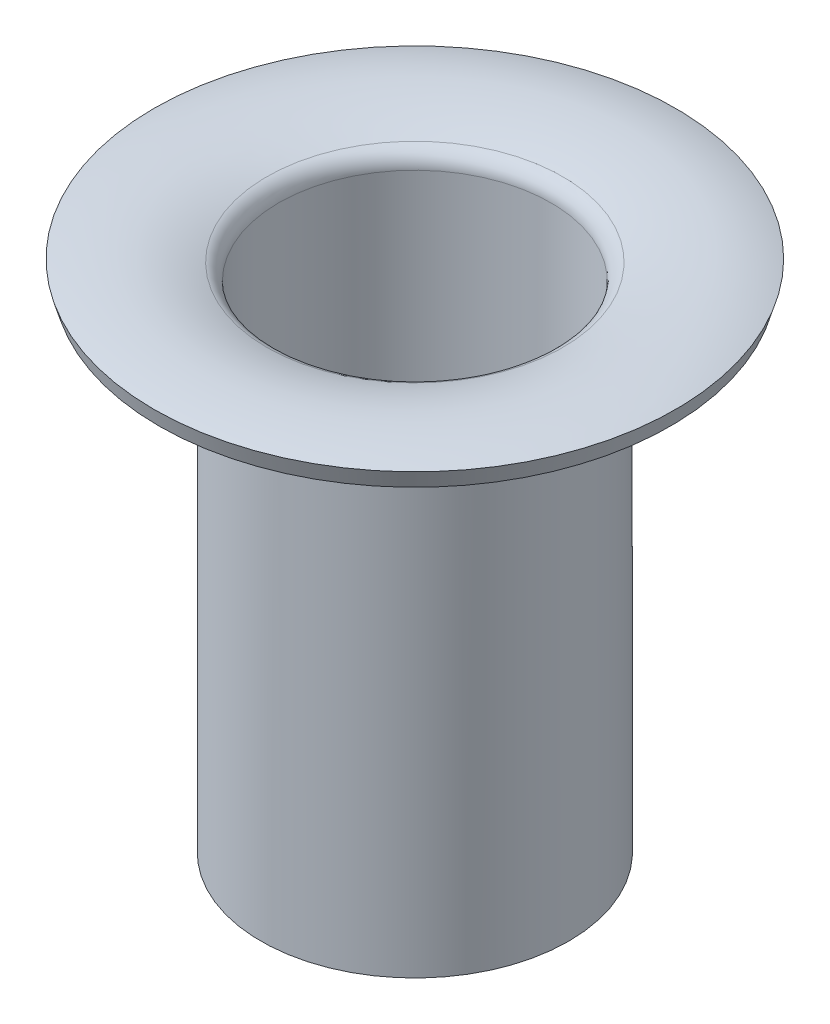
ISO-10303-21;
HEADER;
FILE_DESCRIPTION(('STEP AP214'),'2;1');
FILE_NAME('part.step','',(''),(''),'','','');
FILE_SCHEMA(('AUTOMOTIVE_DESIGN { 1 0 10303 214 1 1 1 1 }'));
ENDSEC;
DATA;
#1=APPLICATION_CONTEXT('core data for automotive mechanical design processes');
#2=APPLICATION_PROTOCOL_DEFINITION('international standard','automotive_design',2000,#1);
#3=PRODUCT_CONTEXT('',#1,'mechanical');
#4=PRODUCT('Part','Part','',(#3));
#5=PRODUCT_RELATED_PRODUCT_CATEGORY('part','',(#4));
#6=PRODUCT_DEFINITION_FORMATION('','',#4);
#7=PRODUCT_DEFINITION_CONTEXT('part definition',#1,'design');
#8=PRODUCT_DEFINITION('design','',#6,#7);
#9=PRODUCT_DEFINITION_SHAPE('','',#8);
#10=(LENGTH_UNIT() NAMED_UNIT(*) SI_UNIT(.MILLI.,.METRE.));
#11=(NAMED_UNIT(*) PLANE_ANGLE_UNIT() SI_UNIT($,.RADIAN.));
#12=(NAMED_UNIT(*) SI_UNIT($,.STERADIAN.) SOLID_ANGLE_UNIT());
#13=UNCERTAINTY_MEASURE_WITH_UNIT(LENGTH_MEASURE(1.E-05),#10,'distance_accuracy_value','');
#14=(GEOMETRIC_REPRESENTATION_CONTEXT(3) GLOBAL_UNCERTAINTY_ASSIGNED_CONTEXT((#13)) GLOBAL_UNIT_ASSIGNED_CONTEXT((#10,
#11,#12)) REPRESENTATION_CONTEXT('',''));
#15=CARTESIAN_POINT('',(0.,0.,0.));
#16=DIRECTION('',(0.,0.,1.));
#17=DIRECTION('',(1.,0.,0.));
#18=AXIS2_PLACEMENT_3D('',#15,#16,#17);
#19=CARTESIAN_POINT('',(0.,-1.75,0.));
#20=DIRECTION('',(0.,-1.,0.));
#21=DIRECTION('',(0.,0.,-1.));
#22=AXIS2_PLACEMENT_3D('',#19,#20,#21);
#23=TOROIDAL_SURFACE('',#22,2.,1.58);
#24=CARTESIAN_POINT('',(0.,-0.235862540950143,0.));
#25=DIRECTION('',(0.,-1.,0.));
#26=DIRECTION('',(1.,0.,0.));
#27=AXIS2_PLACEMENT_3D('',#24,#25,#26);
#28=CIRCLE('',#27,2.45142857142857);
#29=CARTESIAN_POINT('',(-2.45142857142857,-0.235862540950143,0.));
#30=VERTEX_POINT('',#29);
#31=CARTESIAN_POINT('',(0.,-0.235862540950143,2.45142857142857));
#32=VERTEX_POINT('',#31);
#33=EDGE_CURVE('E89',#30,#32,#28,.T.);
#34=ORIENTED_EDGE('',*,*,#33,.T.);
#35=CARTESIAN_POINT('',(0.,-1.75,2.));
#36=DIRECTION('',(-1.,0.,0.));
#37=DIRECTION('',(0.,0.,1.));
#38=AXIS2_PLACEMENT_3D('',#35,#36,#37);
#39=CIRCLE('',#38,1.58);
#40=CARTESIAN_POINT('',(0.,-0.25977350714732,1.475));
#41=VERTEX_POINT('',#40);
#42=EDGE_CURVE('E13',#32,#41,#39,.T.);
#43=ORIENTED_EDGE('',*,*,#42,.T.);
#44=CARTESIAN_POINT('',(0.,-0.25977350714732,0.));
#45=DIRECTION('',(0.,-1.,0.));
#46=DIRECTION('',(1.,0.,0.));
#47=AXIS2_PLACEMENT_3D('',#44,#45,#46);
#48=CIRCLE('',#47,1.475);
#49=CARTESIAN_POINT('',(-1.475,-0.25977350714732,0.));
#50=VERTEX_POINT('',#49);
#51=EDGE_CURVE('E86',#50,#41,#48,.T.);
#52=ORIENTED_EDGE('',*,*,#51,.F.);
#53=CARTESIAN_POINT('',(0.,-0.25977350714732,0.));
#54=DIRECTION('',(0.,-1.,0.));
#55=DIRECTION('',(1.,0.,0.));
#56=AXIS2_PLACEMENT_3D('',#53,#54,#55);
#57=CIRCLE('',#56,1.475);
#58=EDGE_CURVE('E28',#41,#50,#57,.T.);
#59=ORIENTED_EDGE('',*,*,#58,.F.);
#60=ORIENTED_EDGE('',*,*,#42,.F.);
#61=CARTESIAN_POINT('',(0.,-0.235862540950143,0.));
#62=DIRECTION('',(0.,-1.,0.));
#63=DIRECTION('',(1.,0.,0.));
#64=AXIS2_PLACEMENT_3D('',#61,#62,#63);
#65=CIRCLE('',#64,2.45142857142857);
#66=EDGE_CURVE('E34',#32,#30,#65,.T.);
#67=ORIENTED_EDGE('',*,*,#66,.T.);
#68=EDGE_LOOP('',(#34,#43,#52,#59,#60,#67));
#69=FACE_BOUND('',#68,.T.);
#70=ADVANCED_FACE('F24',(#69),#23,.F.);
#71=CARTESIAN_POINT('',(0.,-0.15440577891265,0.));
#72=DIRECTION('',(0.,1.,0.));
#73=DIRECTION('',(1.,0.,0.));
#74=AXIS2_PLACEMENT_3D('',#71,#72,#73);
#75=CONICAL_SURFACE('',#74,2.47571428571429,0.289751701436047);
#76=ORIENTED_EDGE('',*,*,#33,.F.);
#77=DIRECTION('',(-0.285714285714285,0.95831484749991,0.));
#78=VECTOR('',#77,1.);
#79=CARTESIAN_POINT('',(-2.47571428571429,-0.15440577891265,0.));
#80=LINE('',#79,#78);
#81=CARTESIAN_POINT('',(-2.5,-0.0729490168751576,0.));
#82=VERTEX_POINT('',#81);
#83=EDGE_CURVE('E121',#30,#82,#80,.T.);
#84=ORIENTED_EDGE('',*,*,#83,.T.);
#85=CARTESIAN_POINT('',(0.,-0.0729490168751579,0.));
#86=DIRECTION('',(0.,-1.,0.));
#87=DIRECTION('',(1.,0.,0.));
#88=AXIS2_PLACEMENT_3D('',#85,#86,#87);
#89=CIRCLE('',#88,2.5);
#90=CARTESIAN_POINT('',(0.,-0.0729490168751579,2.5));
#91=VERTEX_POINT('',#90);
#92=EDGE_CURVE('E107',#82,#91,#89,.T.);
#93=ORIENTED_EDGE('',*,*,#92,.T.);
#94=CARTESIAN_POINT('',(0.,-0.0729490168751579,0.));
#95=DIRECTION('',(0.,-1.,0.));
#96=DIRECTION('',(1.,0.,0.));
#97=AXIS2_PLACEMENT_3D('',#94,#95,#96);
#98=CIRCLE('',#97,2.5);
#99=EDGE_CURVE('E111',#91,#82,#98,.T.);
#100=ORIENTED_EDGE('',*,*,#99,.T.);
#101=ORIENTED_EDGE('',*,*,#83,.F.);
#102=ORIENTED_EDGE('',*,*,#66,.F.);
#103=EDGE_LOOP('',(#76,#84,#93,#100,#101,#102));
#104=FACE_BOUND('',#103,.T.);
#105=ADVANCED_FACE('F26',(#104),#75,.T.);
#106=CARTESIAN_POINT('',(0.,-1.75,0.));
#107=DIRECTION('',(0.,-1.,0.));
#108=DIRECTION('',(0.,0.,-1.));
#109=AXIS2_PLACEMENT_3D('',#106,#107,#108);
#110=TOROIDAL_SURFACE('',#109,2.,1.75);
#111=ORIENTED_EDGE('',*,*,#92,.F.);
#112=ORIENTED_EDGE('',*,*,#99,.F.);
#113=CARTESIAN_POINT('',(0.,-1.75,2.));
#114=DIRECTION('',(-1.,0.,0.));
#115=DIRECTION('',(0.,0.,1.));
#116=AXIS2_PLACEMENT_3D('',#113,#114,#115);
#117=CIRCLE('',#116,1.75);
#118=CARTESIAN_POINT('',(0.,-0.099432681966968,1.41851265822785));
#119=VERTEX_POINT('',#118);
#120=EDGE_CURVE('E117',#91,#119,#117,.T.);
#121=ORIENTED_EDGE('',*,*,#120,.T.);
#122=CARTESIAN_POINT('',(0.,-0.099432681966968,0.));
#123=DIRECTION('',(0.,-1.,0.));
#124=DIRECTION('',(1.,0.,0.));
#125=AXIS2_PLACEMENT_3D('',#122,#123,#124);
#126=CIRCLE('',#125,1.41851265822785);
#127=EDGE_CURVE('E116',#119,#119,#126,.T.);
#128=ORIENTED_EDGE('',*,*,#127,.T.);
#129=ORIENTED_EDGE('',*,*,#120,.F.);
#130=EDGE_LOOP('',(#111,#112,#121,#128,#129));
#131=FACE_BOUND('',#130,.T.);
#132=ADVANCED_FACE('F157',(#131),#110,.T.);
#133=CARTESIAN_POINT('',(0.,-0.25977350714732,0.));
#134=DIRECTION('',(0.,-1.,0.));
#135=DIRECTION('',(0.,0.,-1.));
#136=AXIS2_PLACEMENT_3D('',#133,#134,#135);
#137=TOROIDAL_SURFACE('',#136,1.475,0.17);
#138=ORIENTED_EDGE('',*,*,#127,.F.);
#139=CARTESIAN_POINT('',(0.,-0.25977350714732,1.475));
#140=DIRECTION('',(-1.,0.,0.));
#141=DIRECTION('',(0.,0.,1.));
#142=AXIS2_PLACEMENT_3D('',#139,#140,#141);
#143=CIRCLE('',#142,0.17);
#144=CARTESIAN_POINT('',(0.,-0.25977350714732,1.305));
#145=VERTEX_POINT('',#144);
#146=EDGE_CURVE('E112',#119,#145,#143,.T.);
#147=ORIENTED_EDGE('',*,*,#146,.T.);
#148=CARTESIAN_POINT('',(0.,-0.25977350714732,0.));
#149=DIRECTION('',(0.,-1.,0.));
#150=DIRECTION('',(1.,0.,0.));
#151=AXIS2_PLACEMENT_3D('',#148,#149,#150);
#152=CIRCLE('',#151,1.305);
#153=CARTESIAN_POINT('',(-1.305,-0.25977350714732,0.));
#154=VERTEX_POINT('',#153);
#155=EDGE_CURVE('E125',#145,#154,#152,.T.);
#156=ORIENTED_EDGE('',*,*,#155,.T.);
#157=CARTESIAN_POINT('',(0.,-0.25977350714732,0.));
#158=DIRECTION('',(0.,-1.,0.));
#159=DIRECTION('',(1.,0.,0.));
#160=AXIS2_PLACEMENT_3D('',#157,#158,#159);
#161=CIRCLE('',#160,1.305);
#162=EDGE_CURVE('E132',#154,#145,#161,.T.);
#163=ORIENTED_EDGE('',*,*,#162,.T.);
#164=ORIENTED_EDGE('',*,*,#146,.F.);
#165=EDGE_LOOP('',(#138,#147,#156,#163,#164));
#166=FACE_BOUND('',#165,.T.);
#167=ADVANCED_FACE('F163',(#166),#137,.T.);
#168=CARTESIAN_POINT('',(0.,-2.62988675357366,0.));
#169=DIRECTION('',(0.,-1.,0.));
#170=DIRECTION('',(1.,0.,0.));
#171=AXIS2_PLACEMENT_3D('',#168,#169,#170);
#172=CYLINDRICAL_SURFACE('',#171,1.305);
#173=CARTESIAN_POINT('',(0.,-5.,0.));
#174=DIRECTION('',(0.,-1.,0.));
#175=DIRECTION('',(1.,0.,0.));
#176=AXIS2_PLACEMENT_3D('',#173,#174,#175);
#177=CIRCLE('',#176,1.305);
#178=CARTESIAN_POINT('',(-1.305,-5.,0.));
#179=VERTEX_POINT('',#178);
#180=EDGE_CURVE('E93',#179,#179,#177,.T.);
#181=ORIENTED_EDGE('',*,*,#180,.T.);
#182=DIRECTION('',(0.,1.,0.));
#183=VECTOR('',#182,1.);
#184=CARTESIAN_POINT('',(-1.305,-2.62988675357366,0.));
#185=LINE('',#184,#183);
#186=EDGE_CURVE('E78',#179,#154,#185,.T.);
#187=ORIENTED_EDGE('',*,*,#186,.T.);
#188=ORIENTED_EDGE('',*,*,#155,.F.);
#189=ORIENTED_EDGE('',*,*,#162,.F.);
#190=ORIENTED_EDGE('',*,*,#186,.F.);
#191=EDGE_LOOP('',(#181,#187,#188,#189,#190));
#192=FACE_BOUND('',#191,.T.);
#193=ADVANCED_FACE('F172',(#192),#172,.F.);
#194=CARTESIAN_POINT('',(1.305,-5.,0.));
#195=DIRECTION('',(0.,-1.,0.));
#196=DIRECTION('',(0.,0.,-1.));
#197=AXIS2_PLACEMENT_3D('',#194,#195,#196);
#198=PLANE('',#197);
#199=ORIENTED_EDGE('',*,*,#180,.F.);
#200=EDGE_LOOP('',(#199));
#201=FACE_BOUND('',#200,.T.);
#202=CARTESIAN_POINT('',(0.,-5.,0.));
#203=DIRECTION('',(0.,-1.,0.));
#204=DIRECTION('',(1.,0.,0.));
#205=AXIS2_PLACEMENT_3D('',#202,#203,#204);
#206=CIRCLE('',#205,1.475);
#207=CARTESIAN_POINT('',(-1.475,-5.,0.));
#208=VERTEX_POINT('',#207);
#209=EDGE_CURVE('E103',#208,#208,#206,.T.);
#210=ORIENTED_EDGE('',*,*,#209,.T.);
#211=EDGE_LOOP('',(#210));
#212=FACE_BOUND('',#211,.T.);
#213=ADVANCED_FACE('F170',(#201,#212),#198,.T.);
#214=CARTESIAN_POINT('',(0.,-2.62988675357366,0.));
#215=DIRECTION('',(0.,-1.,0.));
#216=DIRECTION('',(1.,0.,0.));
#217=AXIS2_PLACEMENT_3D('',#214,#215,#216);
#218=CYLINDRICAL_SURFACE('',#217,1.475);
#219=ORIENTED_EDGE('',*,*,#209,.F.);
#220=DIRECTION('',(0.,1.,0.));
#221=VECTOR('',#220,1.);
#222=CARTESIAN_POINT('',(-1.475,-2.62988675357366,0.));
#223=LINE('',#222,#221);
#224=EDGE_CURVE('E96',#208,#50,#223,.T.);
#225=ORIENTED_EDGE('',*,*,#224,.T.);
#226=ORIENTED_EDGE('',*,*,#51,.T.);
#227=ORIENTED_EDGE('',*,*,#58,.T.);
#228=ORIENTED_EDGE('',*,*,#224,.F.);
#229=EDGE_LOOP('',(#219,#225,#226,#227,#228));
#230=FACE_BOUND('',#229,.T.);
#231=ADVANCED_FACE('F95',(#230),#218,.T.);
#232=CLOSED_SHELL('',(#70,#105,#132,#167,#193,#213,#231));
#233=MANIFOLD_SOLID_BREP('B1',#232);
#234=ADVANCED_BREP_SHAPE_REPRESENTATION('',(#18,#233),#14);
#235=SHAPE_DEFINITION_REPRESENTATION(#9,#234);
ENDSEC;
END-ISO-10303-21;
